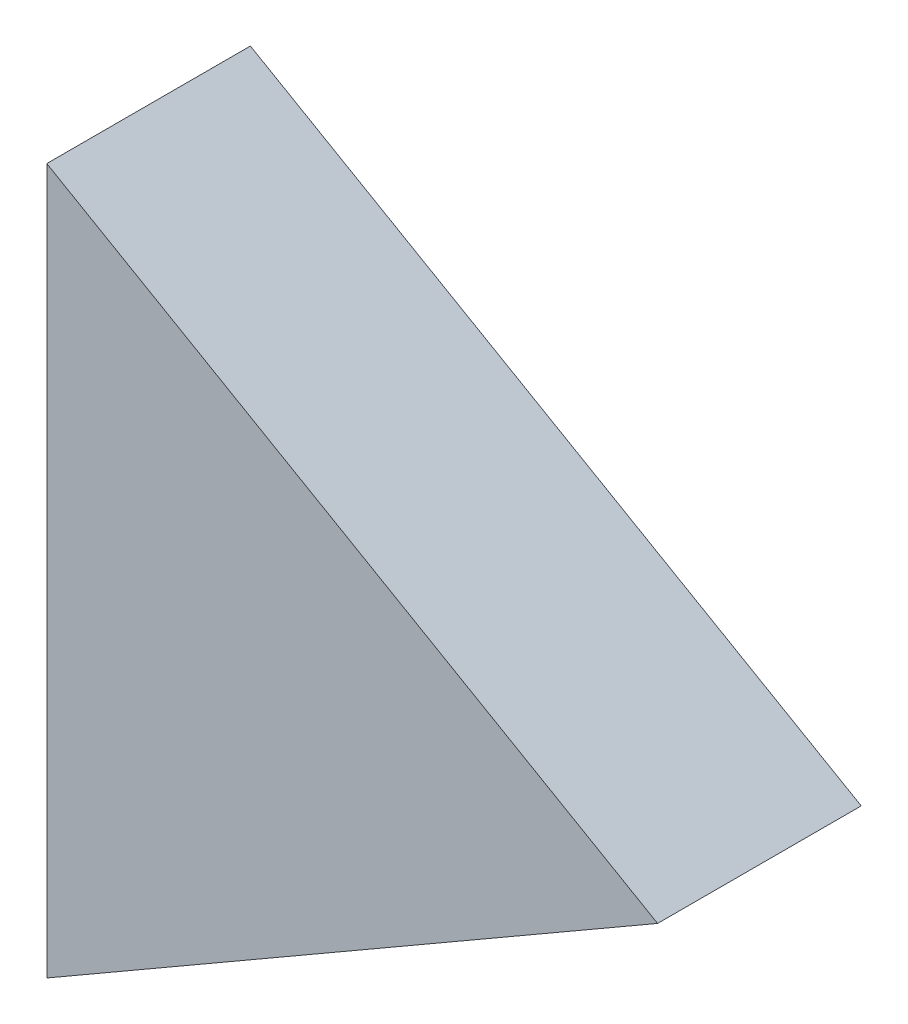
ISO-10303-21;
HEADER;
FILE_DESCRIPTION(('STEP AP214'),'2;1');
FILE_NAME('part.step','',(''),(''),'','','');
FILE_SCHEMA(('AUTOMOTIVE_DESIGN { 1 0 10303 214 1 1 1 1 }'));
ENDSEC;
DATA;
#1=APPLICATION_CONTEXT('core data for automotive mechanical design processes');
#2=APPLICATION_PROTOCOL_DEFINITION('international standard','automotive_design',2000,#1);
#3=PRODUCT_CONTEXT('',#1,'mechanical');
#4=PRODUCT('Part','Part','',(#3));
#5=PRODUCT_RELATED_PRODUCT_CATEGORY('part','',(#4));
#6=PRODUCT_DEFINITION_FORMATION('','',#4);
#7=PRODUCT_DEFINITION_CONTEXT('part definition',#1,'design');
#8=PRODUCT_DEFINITION('design','',#6,#7);
#9=PRODUCT_DEFINITION_SHAPE('','',#8);
#10=(LENGTH_UNIT() NAMED_UNIT(*) SI_UNIT(.MILLI.,.METRE.));
#11=(NAMED_UNIT(*) PLANE_ANGLE_UNIT() SI_UNIT($,.RADIAN.));
#12=(NAMED_UNIT(*) SI_UNIT($,.STERADIAN.) SOLID_ANGLE_UNIT());
#13=UNCERTAINTY_MEASURE_WITH_UNIT(LENGTH_MEASURE(1.E-05),#10,'distance_accuracy_value','');
#14=(GEOMETRIC_REPRESENTATION_CONTEXT(3) GLOBAL_UNCERTAINTY_ASSIGNED_CONTEXT((#13)) GLOBAL_UNIT_ASSIGNED_CONTEXT((#10,
#11,#12)) REPRESENTATION_CONTEXT('',''));
#15=CARTESIAN_POINT('',(0.,0.,0.));
#16=DIRECTION('',(0.,0.,1.));
#17=DIRECTION('',(1.,0.,0.));
#18=AXIS2_PLACEMENT_3D('',#15,#16,#17);
#19=CARTESIAN_POINT('',(-100.,-173.205080756888,50.));
#20=DIRECTION('',(-0.5,0.866025403784439,0.));
#21=DIRECTION('',(-0.866025403784439,-0.5,0.));
#22=AXIS2_PLACEMENT_3D('',#19,#20,#21);
#23=PLANE('',#22);
#24=DIRECTION('',(0.866025403784439,0.5,0.));
#25=VECTOR('',#24,1.);
#26=CARTESIAN_POINT('',(-100.,-173.205080756888,-50.));
#27=LINE('',#26,#25);
#28=CARTESIAN_POINT('',(-100.,-173.205080756888,-50.));
#29=VERTEX_POINT('',#28);
#30=CARTESIAN_POINT('',(200.,0.,-50.));
#31=VERTEX_POINT('',#30);
#32=EDGE_CURVE('E85',#29,#31,#27,.T.);
#33=ORIENTED_EDGE('',*,*,#32,.T.);
#34=DIRECTION('',(0.,0.,-1.));
#35=VECTOR('',#34,1.);
#36=CARTESIAN_POINT('',(200.,0.,50.));
#37=LINE('',#36,#35);
#38=CARTESIAN_POINT('',(200.,0.,50.));
#39=VERTEX_POINT('',#38);
#40=EDGE_CURVE('E11',#39,#31,#37,.T.);
#41=ORIENTED_EDGE('',*,*,#40,.F.);
#42=DIRECTION('',(0.866025403784439,0.5,0.));
#43=VECTOR('',#42,1.);
#44=CARTESIAN_POINT('',(-100.,-173.205080756888,50.));
#45=LINE('',#44,#43);
#46=CARTESIAN_POINT('',(-100.,-173.205080756888,50.));
#47=VERTEX_POINT('',#46);
#48=EDGE_CURVE('E78',#47,#39,#45,.T.);
#49=ORIENTED_EDGE('',*,*,#48,.F.);
#50=DIRECTION('',(0.,0.,-1.));
#51=VECTOR('',#50,1.);
#52=CARTESIAN_POINT('',(-100.,-173.205080756888,50.));
#53=LINE('',#52,#51);
#54=EDGE_CURVE('E86',#47,#29,#53,.T.);
#55=ORIENTED_EDGE('',*,*,#54,.T.);
#56=EDGE_LOOP('',(#33,#41,#49,#55));
#57=FACE_BOUND('',#56,.T.);
#58=ADVANCED_FACE('F38',(#57),#23,.F.);
#59=CARTESIAN_POINT('',(200.,0.,50.));
#60=DIRECTION('',(-0.5,-0.866025403784439,0.));
#61=DIRECTION('',(0.866025403784439,-0.5,0.));
#62=AXIS2_PLACEMENT_3D('',#59,#60,#61);
#63=PLANE('',#62);
#64=DIRECTION('',(-0.866025403784439,0.5,0.));
#65=VECTOR('',#64,1.);
#66=CARTESIAN_POINT('',(200.,0.,-50.));
#67=LINE('',#66,#65);
#68=CARTESIAN_POINT('',(-100.,173.205080756888,-50.));
#69=VERTEX_POINT('',#68);
#70=EDGE_CURVE('E66',#31,#69,#67,.T.);
#71=ORIENTED_EDGE('',*,*,#70,.T.);
#72=DIRECTION('',(0.,0.,-1.));
#73=VECTOR('',#72,1.);
#74=CARTESIAN_POINT('',(-100.,173.205080756888,50.));
#75=LINE('',#74,#73);
#76=CARTESIAN_POINT('',(-100.,173.205080756888,50.));
#77=VERTEX_POINT('',#76);
#78=EDGE_CURVE('E46',#77,#69,#75,.T.);
#79=ORIENTED_EDGE('',*,*,#78,.F.);
#80=DIRECTION('',(-0.866025403784439,0.5,0.));
#81=VECTOR('',#80,1.);
#82=CARTESIAN_POINT('',(200.,0.,50.));
#83=LINE('',#82,#81);
#84=EDGE_CURVE('E74',#39,#77,#83,.T.);
#85=ORIENTED_EDGE('',*,*,#84,.F.);
#86=ORIENTED_EDGE('',*,*,#40,.T.);
#87=EDGE_LOOP('',(#71,#79,#85,#86));
#88=FACE_BOUND('',#87,.T.);
#89=ADVANCED_FACE('F75',(#88),#63,.F.);
#90=CARTESIAN_POINT('',(-100.,173.205080756888,50.));
#91=DIRECTION('',(1.,0.,0.));
#92=DIRECTION('',(0.,1.,0.));
#93=AXIS2_PLACEMENT_3D('',#90,#91,#92);
#94=PLANE('',#93);
#95=DIRECTION('',(0.,-1.,0.));
#96=VECTOR('',#95,1.);
#97=CARTESIAN_POINT('',(-100.,173.205080756888,-50.));
#98=LINE('',#97,#96);
#99=EDGE_CURVE('E71',#69,#29,#98,.T.);
#100=ORIENTED_EDGE('',*,*,#99,.T.);
#101=ORIENTED_EDGE('',*,*,#54,.F.);
#102=DIRECTION('',(0.,-1.,0.));
#103=VECTOR('',#102,1.);
#104=CARTESIAN_POINT('',(-100.,173.205080756888,50.));
#105=LINE('',#104,#103);
#106=EDGE_CURVE('E54',#77,#47,#105,.T.);
#107=ORIENTED_EDGE('',*,*,#106,.F.);
#108=ORIENTED_EDGE('',*,*,#78,.T.);
#109=EDGE_LOOP('',(#100,#101,#107,#108));
#110=FACE_BOUND('',#109,.T.);
#111=ADVANCED_FACE('F93',(#110),#94,.F.);
#112=CARTESIAN_POINT('',(0.,0.,50.));
#113=DIRECTION('',(0.,0.,1.));
#114=DIRECTION('',(1.,0.,0.));
#115=AXIS2_PLACEMENT_3D('',#112,#113,#114);
#116=PLANE('',#115);
#117=ORIENTED_EDGE('',*,*,#48,.T.);
#118=ORIENTED_EDGE('',*,*,#84,.T.);
#119=ORIENTED_EDGE('',*,*,#106,.T.);
#120=EDGE_LOOP('',(#117,#118,#119));
#121=FACE_BOUND('',#120,.T.);
#122=ADVANCED_FACE('F81',(#121),#116,.T.);
#123=CARTESIAN_POINT('',(0.,0.,-50.));
#124=DIRECTION('',(0.,0.,1.));
#125=DIRECTION('',(1.,0.,0.));
#126=AXIS2_PLACEMENT_3D('',#123,#124,#125);
#127=PLANE('',#126);
#128=ORIENTED_EDGE('',*,*,#32,.F.);
#129=ORIENTED_EDGE('',*,*,#99,.F.);
#130=ORIENTED_EDGE('',*,*,#70,.F.);
#131=EDGE_LOOP('',(#128,#129,#130));
#132=FACE_BOUND('',#131,.T.);
#133=ADVANCED_FACE('F94',(#132),#127,.F.);
#134=CLOSED_SHELL('',(#58,#89,#111,#122,#133));
#135=MANIFOLD_SOLID_BREP('B2',#134);
#136=ADVANCED_BREP_SHAPE_REPRESENTATION('',(#18,#135),#14);
#137=SHAPE_DEFINITION_REPRESENTATION(#9,#136);
ENDSEC;
END-ISO-10303-21;
